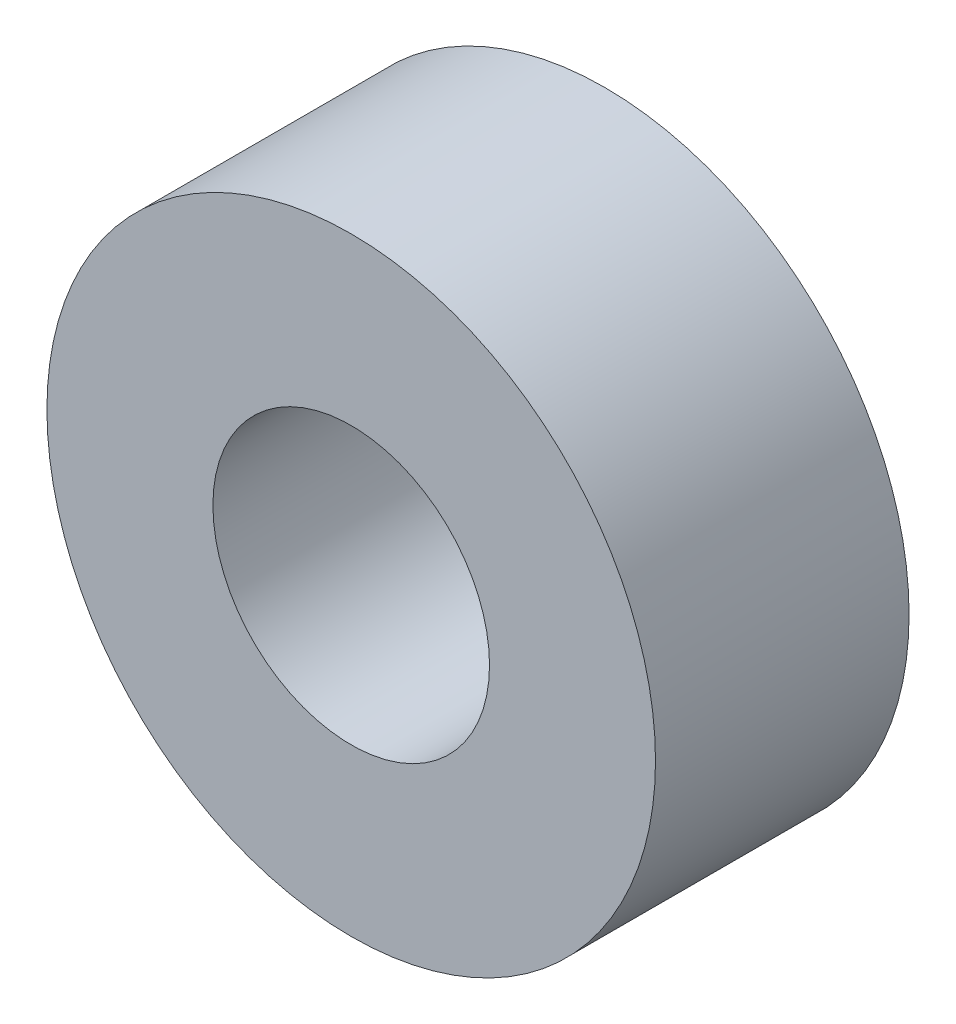
ISO-10303-21;
HEADER;
FILE_DESCRIPTION(('STEP AP214'),'2;1');
FILE_NAME('part.step','',(''),(''),'','','');
FILE_SCHEMA(('AUTOMOTIVE_DESIGN { 1 0 10303 214 1 1 1 1 }'));
ENDSEC;
DATA;
#1=APPLICATION_CONTEXT('core data for automotive mechanical design processes');
#2=APPLICATION_PROTOCOL_DEFINITION('international standard','automotive_design',2000,#1);
#3=PRODUCT_CONTEXT('',#1,'mechanical');
#4=PRODUCT('Part','Part','',(#3));
#5=PRODUCT_RELATED_PRODUCT_CATEGORY('part','',(#4));
#6=PRODUCT_DEFINITION_FORMATION('','',#4);
#7=PRODUCT_DEFINITION_CONTEXT('part definition',#1,'design');
#8=PRODUCT_DEFINITION('design','',#6,#7);
#9=PRODUCT_DEFINITION_SHAPE('','',#8);
#10=(LENGTH_UNIT() NAMED_UNIT(*) SI_UNIT(.MILLI.,.METRE.));
#11=(NAMED_UNIT(*) PLANE_ANGLE_UNIT() SI_UNIT($,.RADIAN.));
#12=(NAMED_UNIT(*) SI_UNIT($,.STERADIAN.) SOLID_ANGLE_UNIT());
#13=UNCERTAINTY_MEASURE_WITH_UNIT(LENGTH_MEASURE(1.E-05),#10,'distance_accuracy_value','');
#14=(GEOMETRIC_REPRESENTATION_CONTEXT(3) GLOBAL_UNCERTAINTY_ASSIGNED_CONTEXT((#13)) GLOBAL_UNIT_ASSIGNED_CONTEXT((#10,
#11,#12)) REPRESENTATION_CONTEXT('',''));
#15=CARTESIAN_POINT('',(0.,0.,0.));
#16=DIRECTION('',(0.,0.,1.));
#17=DIRECTION('',(1.,0.,0.));
#18=AXIS2_PLACEMENT_3D('',#15,#16,#17);
#19=CARTESIAN_POINT('',(0.,0.,1.375));
#20=DIRECTION('',(0.,0.,1.));
#21=DIRECTION('',(1.,0.,0.));
#22=AXIS2_PLACEMENT_3D('',#19,#20,#21);
#23=PLANE('',#22);
#24=CARTESIAN_POINT('',(0.,0.,1.375));
#25=DIRECTION('',(0.,0.,1.));
#26=DIRECTION('',(1.,0.,0.));
#27=AXIS2_PLACEMENT_3D('',#24,#25,#26);
#28=CIRCLE('',#27,3.3);
#29=CARTESIAN_POINT('',(3.3,0.,1.375));
#30=VERTEX_POINT('',#29);
#31=EDGE_CURVE('E10',#30,#30,#28,.T.);
#32=ORIENTED_EDGE('',*,*,#31,.T.);
#33=EDGE_LOOP('',(#32));
#34=FACE_BOUND('',#33,.T.);
#35=CARTESIAN_POINT('',(0.,0.,1.375));
#36=DIRECTION('',(0.,0.,1.));
#37=DIRECTION('',(1.,0.,0.));
#38=AXIS2_PLACEMENT_3D('',#35,#36,#37);
#39=CIRCLE('',#38,1.5);
#40=CARTESIAN_POINT('',(1.5,0.,1.375));
#41=VERTEX_POINT('',#40);
#42=EDGE_CURVE('E50',#41,#41,#39,.T.);
#43=ORIENTED_EDGE('',*,*,#42,.F.);
#44=EDGE_LOOP('',(#43));
#45=FACE_BOUND('',#44,.T.);
#46=ADVANCED_FACE('F37',(#34,#45),#23,.T.);
#47=CARTESIAN_POINT('',(0.,0.,-1.375));
#48=DIRECTION('',(0.,0.,1.));
#49=DIRECTION('',(1.,0.,0.));
#50=AXIS2_PLACEMENT_3D('',#47,#48,#49);
#51=PLANE('',#50);
#52=CARTESIAN_POINT('',(0.,0.,-1.375));
#53=DIRECTION('',(0.,0.,1.));
#54=DIRECTION('',(1.,0.,0.));
#55=AXIS2_PLACEMENT_3D('',#52,#53,#54);
#56=CIRCLE('',#55,3.3);
#57=CARTESIAN_POINT('',(3.3,0.,-1.375));
#58=VERTEX_POINT('',#57);
#59=EDGE_CURVE('E41',#58,#58,#56,.T.);
#60=ORIENTED_EDGE('',*,*,#59,.F.);
#61=EDGE_LOOP('',(#60));
#62=FACE_BOUND('',#61,.T.);
#63=CARTESIAN_POINT('',(0.,0.,-1.375));
#64=DIRECTION('',(0.,0.,1.));
#65=DIRECTION('',(1.,0.,0.));
#66=AXIS2_PLACEMENT_3D('',#63,#64,#65);
#67=CIRCLE('',#66,1.5);
#68=CARTESIAN_POINT('',(1.5,0.,-1.375));
#69=VERTEX_POINT('',#68);
#70=EDGE_CURVE('E52',#69,#69,#67,.T.);
#71=ORIENTED_EDGE('',*,*,#70,.T.);
#72=EDGE_LOOP('',(#71));
#73=FACE_BOUND('',#72,.T.);
#74=ADVANCED_FACE('F64',(#62,#73),#51,.F.);
#75=CARTESIAN_POINT('',(0.,0.,1.375));
#76=DIRECTION('',(0.,0.,-1.));
#77=DIRECTION('',(-1.,0.,0.));
#78=AXIS2_PLACEMENT_3D('',#75,#76,#77);
#79=CYLINDRICAL_SURFACE('',#78,3.3);
#80=ORIENTED_EDGE('',*,*,#31,.F.);
#81=EDGE_LOOP('',(#80));
#82=FACE_BOUND('',#81,.T.);
#83=ORIENTED_EDGE('',*,*,#59,.T.);
#84=EDGE_LOOP('',(#83));
#85=FACE_BOUND('',#84,.T.);
#86=ADVANCED_FACE('F39',(#82,#85),#79,.T.);
#87=CARTESIAN_POINT('',(0.,0.,1.375));
#88=DIRECTION('',(0.,0.,-1.));
#89=DIRECTION('',(-1.,0.,0.));
#90=AXIS2_PLACEMENT_3D('',#87,#88,#89);
#91=CYLINDRICAL_SURFACE('',#90,1.5);
#92=ORIENTED_EDGE('',*,*,#42,.T.);
#93=EDGE_LOOP('',(#92));
#94=FACE_BOUND('',#93,.T.);
#95=ORIENTED_EDGE('',*,*,#70,.F.);
#96=EDGE_LOOP('',(#95));
#97=FACE_BOUND('',#96,.T.);
#98=ADVANCED_FACE('F60',(#94,#97),#91,.F.);
#99=CLOSED_SHELL('',(#46,#74,#86,#98));
#100=MANIFOLD_SOLID_BREP('B2',#99);
#101=ADVANCED_BREP_SHAPE_REPRESENTATION('',(#18,#100),#14);
#102=SHAPE_DEFINITION_REPRESENTATION(#9,#101);
ENDSEC;
END-ISO-10303-21;
